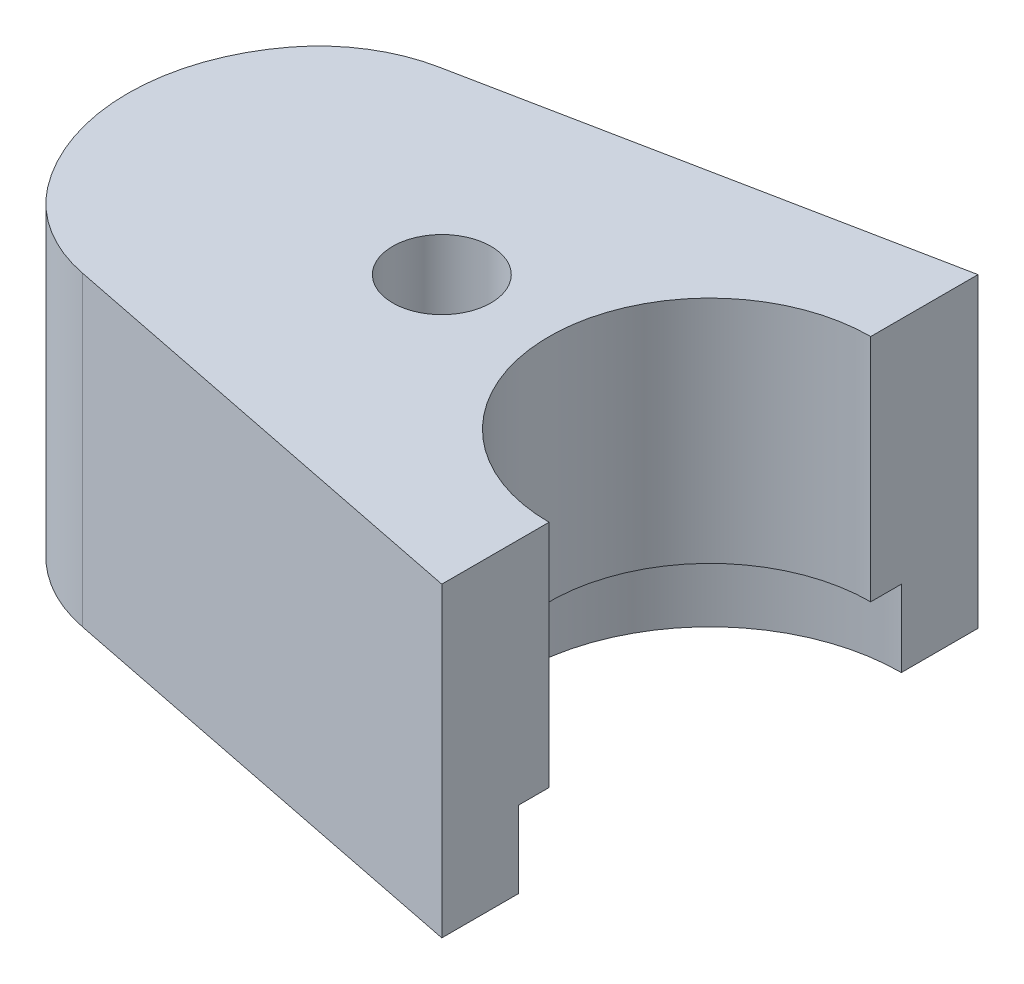
ISO-10303-21;
HEADER;
FILE_DESCRIPTION(('STEP AP214'),'2;1');
FILE_NAME('part.step','',(''),(''),'','','');
FILE_SCHEMA(('AUTOMOTIVE_DESIGN { 1 0 10303 214 1 1 1 1 }'));
ENDSEC;
DATA;
#1=APPLICATION_CONTEXT('core data for automotive mechanical design processes');
#2=APPLICATION_PROTOCOL_DEFINITION('international standard','automotive_design',2000,#1);
#3=PRODUCT_CONTEXT('',#1,'mechanical');
#4=PRODUCT('Part','Part','',(#3));
#5=PRODUCT_RELATED_PRODUCT_CATEGORY('part','',(#4));
#6=PRODUCT_DEFINITION_FORMATION('','',#4);
#7=PRODUCT_DEFINITION_CONTEXT('part definition',#1,'design');
#8=PRODUCT_DEFINITION('design','',#6,#7);
#9=PRODUCT_DEFINITION_SHAPE('','',#8);
#10=(LENGTH_UNIT() NAMED_UNIT(*) SI_UNIT(.MILLI.,.METRE.));
#11=(NAMED_UNIT(*) PLANE_ANGLE_UNIT() SI_UNIT($,.RADIAN.));
#12=(NAMED_UNIT(*) SI_UNIT($,.STERADIAN.) SOLID_ANGLE_UNIT());
#13=UNCERTAINTY_MEASURE_WITH_UNIT(LENGTH_MEASURE(1.E-05),#10,'distance_accuracy_value','');
#14=(GEOMETRIC_REPRESENTATION_CONTEXT(3) GLOBAL_UNCERTAINTY_ASSIGNED_CONTEXT((#13)) GLOBAL_UNIT_ASSIGNED_CONTEXT((#10,
#11,#12)) REPRESENTATION_CONTEXT('',''));
#15=CARTESIAN_POINT('',(0.,0.,0.));
#16=DIRECTION('',(0.,0.,1.));
#17=DIRECTION('',(1.,0.,0.));
#18=AXIS2_PLACEMENT_3D('',#15,#16,#17);
#19=CARTESIAN_POINT('',(-3.9873014814638,0.5,0.183542929297438));
#20=DIRECTION('',(0.,-1.,0.));
#21=DIRECTION('',(0.,0.,-1.));
#22=AXIS2_PLACEMENT_3D('',#19,#20,#21);
#23=CYLINDRICAL_SURFACE('',#22,1.);
#24=CARTESIAN_POINT('',(-3.9873014814638,0.,0.183542929297438));
#25=DIRECTION('',(0.,1.,0.));
#26=DIRECTION('',(0.,0.,1.));
#27=AXIS2_PLACEMENT_3D('',#24,#25,#26);
#28=CIRCLE('',#27,1.);
#29=CARTESIAN_POINT('',(-4.183235690524,0.,1.16415997265328));
#30=VERTEX_POINT('',#29);
#31=CARTESIAN_POINT('',(-4.77830641967648,0.,0.795352693622231));
#32=VERTEX_POINT('',#31);
#33=EDGE_CURVE('E87',#30,#32,#28,.F.);
#34=ORIENTED_EDGE('',*,*,#33,.F.);
#35=DIRECTION('',(0.,-1.,0.));
#36=VECTOR('',#35,1.);
#37=CARTESIAN_POINT('',(-4.183235690524,0.5,1.16415997265328));
#38=LINE('',#37,#36);
#39=CARTESIAN_POINT('',(-4.183235690524,2.,1.16415997265328));
#40=VERTEX_POINT('',#39);
#41=EDGE_CURVE('E11',#40,#30,#38,.T.);
#42=ORIENTED_EDGE('',*,*,#41,.F.);
#43=CARTESIAN_POINT('',(-3.9873014814638,2.,0.183542929297438));
#44=DIRECTION('',(0.,1.,0.));
#45=DIRECTION('',(0.,0.,1.));
#46=AXIS2_PLACEMENT_3D('',#43,#44,#45);
#47=CIRCLE('',#46,1.);
#48=CARTESIAN_POINT('',(-4.77830641967648,2.,0.795352693622231));
#49=VERTEX_POINT('',#48);
#50=EDGE_CURVE('E176',#40,#49,#47,.F.);
#51=ORIENTED_EDGE('',*,*,#50,.T.);
#52=DIRECTION('',(0.,-1.,0.));
#53=VECTOR('',#52,1.);
#54=CARTESIAN_POINT('',(-4.77830641967648,0.5,0.795352693622231));
#55=LINE('',#54,#53);
#56=EDGE_CURVE('E103',#49,#32,#55,.T.);
#57=ORIENTED_EDGE('',*,*,#56,.T.);
#58=EDGE_LOOP('',(#34,#42,#51,#57));
#59=FACE_BOUND('',#58,.T.);
#60=ADVANCED_FACE('F33',(#59),#23,.T.);
#61=CARTESIAN_POINT('',(-0.384272849561752,0.5,1.92321957143991));
#62=DIRECTION('',(-0.195934209060197,0.,0.980617043355843));
#63=DIRECTION('',(0.980617043355843,0.,0.195934209060197));
#64=AXIS2_PLACEMENT_3D('',#61,#62,#63);
#65=PLANE('',#64);
#66=DIRECTION('',(-0.980617043355843,0.,-0.195934209060197));
#67=VECTOR('',#66,1.);
#68=CARTESIAN_POINT('',(-0.384272849561752,0.,1.92321957143991));
#69=LINE('',#68,#67);
#70=CARTESIAN_POINT('',(-1.24999999999968,0.,1.7502411741825));
#71=VERTEX_POINT('',#70);
#72=EDGE_CURVE('E138',#71,#30,#69,.T.);
#73=ORIENTED_EDGE('',*,*,#72,.F.);
#74=DIRECTION('',(0.,-1.,0.));
#75=VECTOR('',#74,1.);
#76=CARTESIAN_POINT('',(-1.24999999999968,0.5,1.7502411741825));
#77=LINE('',#76,#75);
#78=CARTESIAN_POINT('',(-1.24999999999968,2.,1.7502411741825));
#79=VERTEX_POINT('',#78);
#80=EDGE_CURVE('E43',#79,#71,#77,.T.);
#81=ORIENTED_EDGE('',*,*,#80,.F.);
#82=DIRECTION('',(-0.980617043355843,0.,-0.195934209060197));
#83=VECTOR('',#82,1.);
#84=CARTESIAN_POINT('',(-0.384272849561752,2.,1.92321957143991));
#85=LINE('',#84,#83);
#86=EDGE_CURVE('E171',#79,#40,#85,.T.);
#87=ORIENTED_EDGE('',*,*,#86,.T.);
#88=ORIENTED_EDGE('',*,*,#41,.T.);
#89=EDGE_LOOP('',(#73,#81,#87,#88));
#90=FACE_BOUND('',#89,.T.);
#91=ADVANCED_FACE('F165',(#90),#65,.T.);
#92=CARTESIAN_POINT('',(-1.24999999999968,0.5,0.));
#93=DIRECTION('',(1.,0.,0.));
#94=DIRECTION('',(0.,0.,-1.));
#95=AXIS2_PLACEMENT_3D('',#92,#93,#94);
#96=PLANE('',#95);
#97=DIRECTION('',(0.,0.,1.));
#98=VECTOR('',#97,1.);
#99=CARTESIAN_POINT('',(-1.24999999999968,0.,0.));
#100=LINE('',#99,#98);
#101=CARTESIAN_POINT('',(-1.24999999999968,0.,1.24999999999969));
#102=VERTEX_POINT('',#101);
#103=EDGE_CURVE('E140',#102,#71,#100,.T.);
#104=ORIENTED_EDGE('',*,*,#103,.F.);
#105=DIRECTION('',(0.,-1.,0.));
#106=VECTOR('',#105,1.);
#107=CARTESIAN_POINT('',(-1.24999999999968,0.5,1.24999999999969));
#108=LINE('',#107,#106);
#109=CARTESIAN_POINT('',(-1.24999999999968,0.5,1.24999999999969));
#110=VERTEX_POINT('',#109);
#111=EDGE_CURVE('E120',#110,#102,#108,.T.);
#112=ORIENTED_EDGE('',*,*,#111,.F.);
#113=DIRECTION('',(0.,0.,-1.));
#114=VECTOR('',#113,1.);
#115=CARTESIAN_POINT('',(-1.24999999999968,0.5,0.));
#116=LINE('',#115,#114);
#117=CARTESIAN_POINT('',(-1.24999999999968,0.5,1.04999999999969));
#118=VERTEX_POINT('',#117);
#119=EDGE_CURVE('E51',#110,#118,#116,.T.);
#120=ORIENTED_EDGE('',*,*,#119,.T.);
#121=DIRECTION('',(0.,-1.,0.));
#122=VECTOR('',#121,1.);
#123=CARTESIAN_POINT('',(-1.24999999999968,2.,1.04999999999969));
#124=LINE('',#123,#122);
#125=CARTESIAN_POINT('',(-1.24999999999968,2.,1.04999999999969));
#126=VERTEX_POINT('',#125);
#127=EDGE_CURVE('E197',#126,#118,#124,.T.);
#128=ORIENTED_EDGE('',*,*,#127,.F.);
#129=DIRECTION('',(0.,0.,-1.));
#130=VECTOR('',#129,1.);
#131=CARTESIAN_POINT('',(-1.24999999999968,2.,0.));
#132=LINE('',#131,#130);
#133=EDGE_CURVE('E191',#79,#126,#132,.T.);
#134=ORIENTED_EDGE('',*,*,#133,.F.);
#135=ORIENTED_EDGE('',*,*,#80,.T.);
#136=EDGE_LOOP('',(#104,#112,#120,#128,#134,#135));
#137=FACE_BOUND('',#136,.T.);
#138=ADVANCED_FACE('F160',(#137),#96,.T.);
#139=CARTESIAN_POINT('',(-1.24999999999968,0.5,0.));
#140=DIRECTION('',(0.,-1.,0.));
#141=DIRECTION('',(0.,0.,-1.));
#142=AXIS2_PLACEMENT_3D('',#139,#140,#141);
#143=CYLINDRICAL_SURFACE('',#142,1.24999999999969);
#144=CARTESIAN_POINT('',(-1.24999999999968,0.,0.));
#145=DIRECTION('',(0.,1.,0.));
#146=DIRECTION('',(0.,0.,1.));
#147=AXIS2_PLACEMENT_3D('',#144,#145,#146);
#148=CIRCLE('',#147,1.24999999999969);
#149=CARTESIAN_POINT('',(-1.24999999999968,0.,-1.2499999999997));
#150=VERTEX_POINT('',#149);
#151=EDGE_CURVE('E143',#150,#102,#148,.T.);
#152=ORIENTED_EDGE('',*,*,#151,.F.);
#153=DIRECTION('',(0.,-1.,0.));
#154=VECTOR('',#153,1.);
#155=CARTESIAN_POINT('',(-1.24999999999968,0.5,-1.2499999999997));
#156=LINE('',#155,#154);
#157=CARTESIAN_POINT('',(-1.24999999999968,0.5,-1.2499999999997));
#158=VERTEX_POINT('',#157);
#159=EDGE_CURVE('E119',#158,#150,#156,.T.);
#160=ORIENTED_EDGE('',*,*,#159,.F.);
#161=CARTESIAN_POINT('',(-1.24999999999968,0.5,0.));
#162=DIRECTION('',(0.,1.,0.));
#163=DIRECTION('',(0.,0.,1.));
#164=AXIS2_PLACEMENT_3D('',#161,#162,#163);
#165=CIRCLE('',#164,1.24999999999969);
#166=EDGE_CURVE('E90',#158,#110,#165,.T.);
#167=ORIENTED_EDGE('',*,*,#166,.T.);
#168=ORIENTED_EDGE('',*,*,#111,.T.);
#169=EDGE_LOOP('',(#152,#160,#167,#168));
#170=FACE_BOUND('',#169,.T.);
#171=ADVANCED_FACE('F157',(#170),#143,.F.);
#172=CARTESIAN_POINT('',(-1.24999999999968,0.5,0.));
#173=DIRECTION('',(-1.,0.,0.));
#174=DIRECTION('',(0.,0.,1.));
#175=AXIS2_PLACEMENT_3D('',#172,#173,#174);
#176=PLANE('',#175);
#177=DIRECTION('',(0.,0.,-1.));
#178=VECTOR('',#177,1.);
#179=CARTESIAN_POINT('',(-1.24999999999968,0.,0.));
#180=LINE('',#179,#178);
#181=CARTESIAN_POINT('',(-1.24999999999968,0.,-1.7502411741825));
#182=VERTEX_POINT('',#181);
#183=EDGE_CURVE('E110',#150,#182,#180,.T.);
#184=ORIENTED_EDGE('',*,*,#183,.T.);
#185=DIRECTION('',(0.,-1.,0.));
#186=VECTOR('',#185,1.);
#187=CARTESIAN_POINT('',(-1.24999999999968,0.5,-1.7502411741825));
#188=LINE('',#187,#186);
#189=CARTESIAN_POINT('',(-1.24999999999968,2.,-1.7502411741825));
#190=VERTEX_POINT('',#189);
#191=EDGE_CURVE('E116',#190,#182,#188,.T.);
#192=ORIENTED_EDGE('',*,*,#191,.F.);
#193=DIRECTION('',(0.,0.,1.));
#194=VECTOR('',#193,1.);
#195=CARTESIAN_POINT('',(-1.24999999999968,2.,0.));
#196=LINE('',#195,#194);
#197=CARTESIAN_POINT('',(-1.24999999999968,2.,-1.0499999999997));
#198=VERTEX_POINT('',#197);
#199=EDGE_CURVE('E229',#190,#198,#196,.T.);
#200=ORIENTED_EDGE('',*,*,#199,.T.);
#201=DIRECTION('',(0.,-1.,0.));
#202=VECTOR('',#201,1.);
#203=CARTESIAN_POINT('',(-1.24999999999968,2.,-1.0499999999997));
#204=LINE('',#203,#202);
#205=CARTESIAN_POINT('',(-1.24999999999968,0.5,-1.0499999999997));
#206=VERTEX_POINT('',#205);
#207=EDGE_CURVE('E136',#198,#206,#204,.T.);
#208=ORIENTED_EDGE('',*,*,#207,.T.);
#209=DIRECTION('',(0.,0.,1.));
#210=VECTOR('',#209,1.);
#211=CARTESIAN_POINT('',(-1.24999999999968,0.5,0.));
#212=LINE('',#211,#210);
#213=EDGE_CURVE('E130',#158,#206,#212,.T.);
#214=ORIENTED_EDGE('',*,*,#213,.F.);
#215=ORIENTED_EDGE('',*,*,#159,.T.);
#216=EDGE_LOOP('',(#184,#192,#200,#208,#214,#215));
#217=FACE_BOUND('',#216,.T.);
#218=ADVANCED_FACE('F149',(#217),#176,.F.);
#219=CARTESIAN_POINT('',(-0.384272849561752,0.5,-1.92321957143991));
#220=DIRECTION('',(0.195934209060197,0.,0.980617043355843));
#221=DIRECTION('',(0.980617043355843,0.,-0.195934209060197));
#222=AXIS2_PLACEMENT_3D('',#219,#220,#221);
#223=PLANE('',#222);
#224=DIRECTION('',(-0.980617043355843,0.,0.195934209060197));
#225=VECTOR('',#224,1.);
#226=CARTESIAN_POINT('',(-0.384272849561752,0.,-1.92321957143991));
#227=LINE('',#226,#225);
#228=CARTESIAN_POINT('',(-4.183235690524,0.,-1.16415997265328));
#229=VERTEX_POINT('',#228);
#230=EDGE_CURVE('E108',#182,#229,#227,.T.);
#231=ORIENTED_EDGE('',*,*,#230,.T.);
#232=DIRECTION('',(0.,-1.,0.));
#233=VECTOR('',#232,1.);
#234=CARTESIAN_POINT('',(-4.183235690524,0.5,-1.16415997265328));
#235=LINE('',#234,#233);
#236=CARTESIAN_POINT('',(-4.183235690524,2.,-1.16415997265328));
#237=VERTEX_POINT('',#236);
#238=EDGE_CURVE('E102',#237,#229,#235,.T.);
#239=ORIENTED_EDGE('',*,*,#238,.F.);
#240=DIRECTION('',(-0.980617043355843,0.,0.195934209060197));
#241=VECTOR('',#240,1.);
#242=CARTESIAN_POINT('',(-0.384272849561752,2.,-1.92321957143991));
#243=LINE('',#242,#241);
#244=EDGE_CURVE('E186',#190,#237,#243,.T.);
#245=ORIENTED_EDGE('',*,*,#244,.F.);
#246=ORIENTED_EDGE('',*,*,#191,.T.);
#247=EDGE_LOOP('',(#231,#239,#245,#246));
#248=FACE_BOUND('',#247,.T.);
#249=ADVANCED_FACE('F233',(#248),#223,.F.);
#250=CARTESIAN_POINT('',(-3.9873014814638,0.5,-0.183542929297438));
#251=DIRECTION('',(0.,-1.,0.));
#252=DIRECTION('',(0.,0.,-1.));
#253=AXIS2_PLACEMENT_3D('',#250,#251,#252);
#254=CYLINDRICAL_SURFACE('',#253,1.);
#255=CARTESIAN_POINT('',(-3.9873014814638,0.,-0.183542929297438));
#256=DIRECTION('',(0.,1.,0.));
#257=DIRECTION('',(0.,0.,1.));
#258=AXIS2_PLACEMENT_3D('',#255,#256,#257);
#259=CIRCLE('',#258,1.);
#260=CARTESIAN_POINT('',(-4.77830641967648,0.,-0.795352693622231));
#261=VERTEX_POINT('',#260);
#262=EDGE_CURVE('E83',#229,#261,#259,.T.);
#263=ORIENTED_EDGE('',*,*,#262,.T.);
#264=DIRECTION('',(0.,-1.,0.));
#265=VECTOR('',#264,1.);
#266=CARTESIAN_POINT('',(-4.77830641967648,0.5,-0.795352693622231));
#267=LINE('',#266,#265);
#268=CARTESIAN_POINT('',(-4.77830641967648,2.,-0.795352693622231));
#269=VERTEX_POINT('',#268);
#270=EDGE_CURVE('E94',#269,#261,#267,.T.);
#271=ORIENTED_EDGE('',*,*,#270,.F.);
#272=CARTESIAN_POINT('',(-3.9873014814638,2.,-0.183542929297438));
#273=DIRECTION('',(0.,1.,0.));
#274=DIRECTION('',(0.,0.,1.));
#275=AXIS2_PLACEMENT_3D('',#272,#273,#274);
#276=CIRCLE('',#275,1.);
#277=EDGE_CURVE('E183',#237,#269,#276,.T.);
#278=ORIENTED_EDGE('',*,*,#277,.F.);
#279=ORIENTED_EDGE('',*,*,#238,.T.);
#280=EDGE_LOOP('',(#263,#271,#278,#279));
#281=FACE_BOUND('',#280,.T.);
#282=ADVANCED_FACE('F105',(#281),#254,.T.);
#283=CARTESIAN_POINT('',(-3.,0.5,0.));
#284=DIRECTION('',(0.,-1.,0.));
#285=DIRECTION('',(0.,0.,-1.));
#286=AXIS2_PLACEMENT_3D('',#283,#284,#285);
#287=CYLINDRICAL_SURFACE('',#286,0.3207);
#288=CARTESIAN_POINT('',(-3.,0.,0.));
#289=DIRECTION('',(0.,1.,0.));
#290=DIRECTION('',(0.,0.,1.));
#291=AXIS2_PLACEMENT_3D('',#288,#289,#290);
#292=CIRCLE('',#291,0.3207);
#293=CARTESIAN_POINT('',(-3.,0.,0.3207));
#294=VERTEX_POINT('',#293);
#295=EDGE_CURVE('E133',#294,#294,#292,.T.);
#296=ORIENTED_EDGE('',*,*,#295,.F.);
#297=EDGE_LOOP('',(#296));
#298=FACE_BOUND('',#297,.T.);
#299=CARTESIAN_POINT('',(-3.,2.,0.));
#300=DIRECTION('',(0.,1.,0.));
#301=DIRECTION('',(0.,0.,1.));
#302=AXIS2_PLACEMENT_3D('',#299,#300,#301);
#303=CIRCLE('',#302,0.3207);
#304=CARTESIAN_POINT('',(-3.,2.,0.3207));
#305=VERTEX_POINT('',#304);
#306=EDGE_CURVE('E194',#305,#305,#303,.T.);
#307=ORIENTED_EDGE('',*,*,#306,.T.);
#308=EDGE_LOOP('',(#307));
#309=FACE_BOUND('',#308,.T.);
#310=ADVANCED_FACE('F35',(#298,#309),#287,.F.);
#311=CARTESIAN_POINT('',(-3.75,0.5,0.));
#312=DIRECTION('',(0.,-1.,0.));
#313=DIRECTION('',(0.,0.,-1.));
#314=AXIS2_PLACEMENT_3D('',#311,#312,#313);
#315=CYLINDRICAL_SURFACE('',#314,1.3);
#316=CARTESIAN_POINT('',(-3.75,0.,0.));
#317=DIRECTION('',(0.,1.,0.));
#318=DIRECTION('',(0.,0.,1.));
#319=AXIS2_PLACEMENT_3D('',#316,#317,#318);
#320=CIRCLE('',#319,1.3);
#321=EDGE_CURVE('E79',#261,#32,#320,.T.);
#322=ORIENTED_EDGE('',*,*,#321,.T.);
#323=ORIENTED_EDGE('',*,*,#56,.F.);
#324=CARTESIAN_POINT('',(-3.75,2.,0.));
#325=DIRECTION('',(0.,1.,0.));
#326=DIRECTION('',(0.,0.,1.));
#327=AXIS2_PLACEMENT_3D('',#324,#325,#326);
#328=CIRCLE('',#327,1.3);
#329=EDGE_CURVE('E98',#269,#49,#328,.T.);
#330=ORIENTED_EDGE('',*,*,#329,.F.);
#331=ORIENTED_EDGE('',*,*,#270,.T.);
#332=EDGE_LOOP('',(#322,#323,#330,#331));
#333=FACE_BOUND('',#332,.T.);
#334=ADVANCED_FACE('F95',(#333),#315,.T.);
#335=CARTESIAN_POINT('',(0.,0.,0.));
#336=DIRECTION('',(0.,1.,0.));
#337=DIRECTION('',(0.,0.,1.));
#338=AXIS2_PLACEMENT_3D('',#335,#336,#337);
#339=PLANE('',#338);
#340=ORIENTED_EDGE('',*,*,#295,.T.);
#341=EDGE_LOOP('',(#340));
#342=FACE_BOUND('',#341,.T.);
#343=ORIENTED_EDGE('',*,*,#33,.T.);
#344=ORIENTED_EDGE('',*,*,#321,.F.);
#345=ORIENTED_EDGE('',*,*,#262,.F.);
#346=ORIENTED_EDGE('',*,*,#230,.F.);
#347=ORIENTED_EDGE('',*,*,#183,.F.);
#348=ORIENTED_EDGE('',*,*,#151,.T.);
#349=ORIENTED_EDGE('',*,*,#103,.T.);
#350=ORIENTED_EDGE('',*,*,#72,.T.);
#351=EDGE_LOOP('',(#343,#344,#345,#346,#347,#348,#349,#350));
#352=FACE_BOUND('',#351,.T.);
#353=ADVANCED_FACE('F81',(#342,#352),#339,.F.);
#354=CARTESIAN_POINT('',(-1.24999999999968,2.,0.));
#355=DIRECTION('',(0.,-1.,0.));
#356=DIRECTION('',(0.,0.,-1.));
#357=AXIS2_PLACEMENT_3D('',#354,#355,#356);
#358=CYLINDRICAL_SURFACE('',#357,1.04999999999969);
#359=CARTESIAN_POINT('',(-1.24999999999968,0.5,0.));
#360=DIRECTION('',(0.,1.,0.));
#361=DIRECTION('',(0.,0.,1.));
#362=AXIS2_PLACEMENT_3D('',#359,#360,#361);
#363=CIRCLE('',#362,1.04999999999969);
#364=EDGE_CURVE('E198',#206,#118,#363,.T.);
#365=ORIENTED_EDGE('',*,*,#364,.F.);
#366=ORIENTED_EDGE('',*,*,#207,.F.);
#367=CARTESIAN_POINT('',(-1.24999999999968,2.,0.));
#368=DIRECTION('',(0.,1.,0.));
#369=DIRECTION('',(0.,0.,1.));
#370=AXIS2_PLACEMENT_3D('',#367,#368,#369);
#371=CIRCLE('',#370,1.04999999999969);
#372=EDGE_CURVE('E204',#198,#126,#371,.T.);
#373=ORIENTED_EDGE('',*,*,#372,.T.);
#374=ORIENTED_EDGE('',*,*,#127,.T.);
#375=EDGE_LOOP('',(#365,#366,#373,#374));
#376=FACE_BOUND('',#375,.T.);
#377=ADVANCED_FACE('F214',(#376),#358,.F.);
#378=CARTESIAN_POINT('',(0.,2.,0.));
#379=DIRECTION('',(0.,1.,0.));
#380=DIRECTION('',(0.,0.,1.));
#381=AXIS2_PLACEMENT_3D('',#378,#379,#380);
#382=PLANE('',#381);
#383=ORIENTED_EDGE('',*,*,#372,.F.);
#384=ORIENTED_EDGE('',*,*,#199,.F.);
#385=ORIENTED_EDGE('',*,*,#244,.T.);
#386=ORIENTED_EDGE('',*,*,#277,.T.);
#387=ORIENTED_EDGE('',*,*,#329,.T.);
#388=ORIENTED_EDGE('',*,*,#50,.F.);
#389=ORIENTED_EDGE('',*,*,#86,.F.);
#390=ORIENTED_EDGE('',*,*,#133,.T.);
#391=EDGE_LOOP('',(#383,#384,#385,#386,#387,#388,#389,#390));
#392=FACE_BOUND('',#391,.T.);
#393=ORIENTED_EDGE('',*,*,#306,.F.);
#394=EDGE_LOOP('',(#393));
#395=FACE_BOUND('',#394,.T.);
#396=ADVANCED_FACE('F180',(#392,#395),#382,.T.);
#397=CARTESIAN_POINT('',(0.,0.5,0.));
#398=DIRECTION('',(0.,1.,0.));
#399=DIRECTION('',(0.,0.,1.));
#400=AXIS2_PLACEMENT_3D('',#397,#398,#399);
#401=PLANE('',#400);
#402=ORIENTED_EDGE('',*,*,#166,.F.);
#403=ORIENTED_EDGE('',*,*,#213,.T.);
#404=ORIENTED_EDGE('',*,*,#364,.T.);
#405=ORIENTED_EDGE('',*,*,#119,.F.);
#406=EDGE_LOOP('',(#402,#403,#404,#405));
#407=FACE_BOUND('',#406,.T.);
#408=ADVANCED_FACE('F218',(#407),#401,.F.);
#409=CLOSED_SHELL('',(#60,#91,#138,#171,#218,#249,#282,#310,#334,#353,#377,#396,#408));
#410=MANIFOLD_SOLID_BREP('B2',#409);
#411=ADVANCED_BREP_SHAPE_REPRESENTATION('',(#18,#410),#14);
#412=SHAPE_DEFINITION_REPRESENTATION(#9,#411);
ENDSEC;
END-ISO-10303-21;
